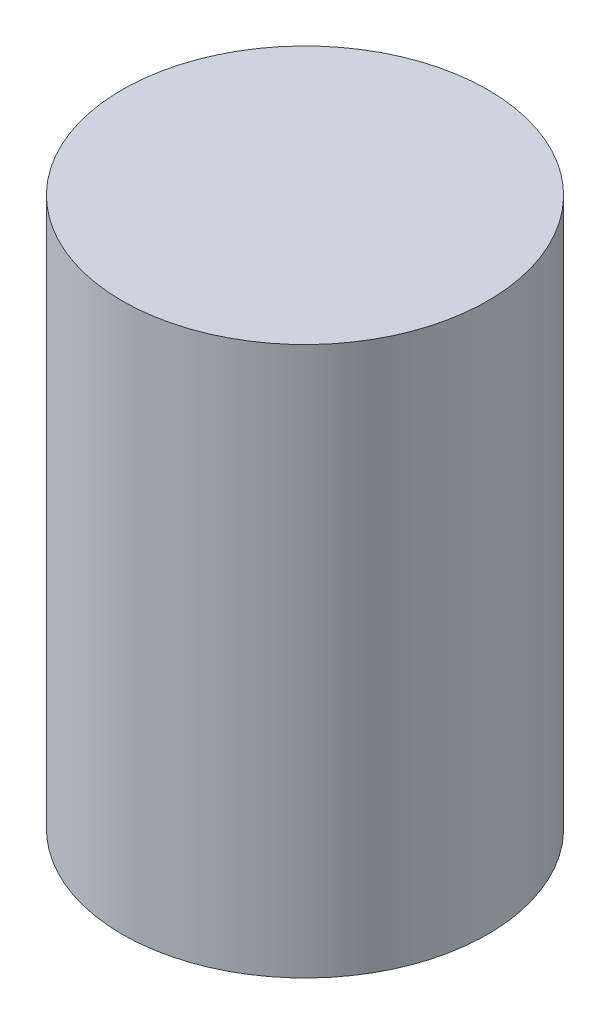
ISO-10303-21;
HEADER;
FILE_DESCRIPTION(('STEP AP214'),'2;1');
FILE_NAME('part.step','',(''),(''),'','','');
FILE_SCHEMA(('AUTOMOTIVE_DESIGN { 1 0 10303 214 1 1 1 1 }'));
ENDSEC;
DATA;
#1=APPLICATION_CONTEXT('core data for automotive mechanical design processes');
#2=APPLICATION_PROTOCOL_DEFINITION('international standard','automotive_design',2000,#1);
#3=PRODUCT_CONTEXT('',#1,'mechanical');
#4=PRODUCT('Part','Part','',(#3));
#5=PRODUCT_RELATED_PRODUCT_CATEGORY('part','',(#4));
#6=PRODUCT_DEFINITION_FORMATION('','',#4);
#7=PRODUCT_DEFINITION_CONTEXT('part definition',#1,'design');
#8=PRODUCT_DEFINITION('design','',#6,#7);
#9=PRODUCT_DEFINITION_SHAPE('','',#8);
#10=(LENGTH_UNIT() NAMED_UNIT(*) SI_UNIT(.MILLI.,.METRE.));
#11=(NAMED_UNIT(*) PLANE_ANGLE_UNIT() SI_UNIT($,.RADIAN.));
#12=(NAMED_UNIT(*) SI_UNIT($,.STERADIAN.) SOLID_ANGLE_UNIT());
#13=UNCERTAINTY_MEASURE_WITH_UNIT(LENGTH_MEASURE(1.E-05),#10,'distance_accuracy_value','');
#14=(GEOMETRIC_REPRESENTATION_CONTEXT(3) GLOBAL_UNCERTAINTY_ASSIGNED_CONTEXT((#13)) GLOBAL_UNIT_ASSIGNED_CONTEXT((#10,
#11,#12)) REPRESENTATION_CONTEXT('',''));
#15=CARTESIAN_POINT('',(0.,0.,0.));
#16=DIRECTION('',(0.,0.,1.));
#17=DIRECTION('',(1.,0.,0.));
#18=AXIS2_PLACEMENT_3D('',#15,#16,#17);
#19=CARTESIAN_POINT('',(0.,3.81,0.));
#20=DIRECTION('',(0.,-1.,0.));
#21=DIRECTION('',(0.,0.,-1.));
#22=AXIS2_PLACEMENT_3D('',#19,#20,#21);
#23=CYLINDRICAL_SURFACE('',#22,1.27);
#24=CARTESIAN_POINT('',(0.,3.81,0.));
#25=DIRECTION('',(0.,1.,0.));
#26=DIRECTION('',(0.,0.,1.));
#27=AXIS2_PLACEMENT_3D('',#24,#25,#26);
#28=CIRCLE('',#27,1.27);
#29=CARTESIAN_POINT('',(0.,3.81,-1.27));
#30=VERTEX_POINT('',#29);
#31=EDGE_CURVE('E10',#30,#30,#28,.T.);
#32=CARTESIAN_POINT('',(0.,0.,0.));
#33=DIRECTION('',(0.,1.,0.));
#34=DIRECTION('',(0.,0.,1.));
#35=AXIS2_PLACEMENT_3D('',#32,#33,#34);
#36=CIRCLE('',#35,1.27);
#37=CARTESIAN_POINT('',(0.,0.,-1.27));
#38=VERTEX_POINT('',#37);
#39=EDGE_CURVE('E34',#38,#38,#36,.T.);
#40=CARTESIAN_POINT('',(0.,3.81,-1.27));
#41=CARTESIAN_POINT('',(0.,3.7703125,-1.27));
#42=CARTESIAN_POINT('',(0.,3.730625,-1.27));
#43=CARTESIAN_POINT('',(0.,3.65125,-1.27));
#44=CARTESIAN_POINT('',(0.,3.6115625,-1.27));
#45=CARTESIAN_POINT('',(0.,3.5321875,-1.27));
#46=CARTESIAN_POINT('',(0.,3.4925,-1.27));
#47=CARTESIAN_POINT('',(0.,3.413125,-1.27));
#48=CARTESIAN_POINT('',(0.,3.3734375,-1.27));
#49=CARTESIAN_POINT('',(0.,3.2940625,-1.27));
#50=CARTESIAN_POINT('',(0.,3.254375,-1.27));
#51=CARTESIAN_POINT('',(0.,3.175,-1.27));
#52=CARTESIAN_POINT('',(0.,3.1353125,-1.27));
#53=CARTESIAN_POINT('',(0.,3.0559375,-1.27));
#54=CARTESIAN_POINT('',(0.,3.01625,-1.27));
#55=CARTESIAN_POINT('',(0.,2.936875,-1.27));
#56=CARTESIAN_POINT('',(0.,2.8971875,-1.27));
#57=CARTESIAN_POINT('',(0.,2.8178125,-1.27));
#58=CARTESIAN_POINT('',(0.,2.778125,-1.27));
#59=CARTESIAN_POINT('',(0.,2.69875,-1.27));
#60=CARTESIAN_POINT('',(0.,2.6590625,-1.27));
#61=CARTESIAN_POINT('',(0.,2.5796875,-1.27));
#62=CARTESIAN_POINT('',(0.,2.54,-1.27));
#63=CARTESIAN_POINT('',(0.,2.460625,-1.27));
#64=CARTESIAN_POINT('',(0.,2.4209375,-1.27));
#65=CARTESIAN_POINT('',(0.,2.3415625,-1.27));
#66=CARTESIAN_POINT('',(0.,2.301875,-1.27));
#67=CARTESIAN_POINT('',(0.,2.2225,-1.27));
#68=CARTESIAN_POINT('',(0.,2.1828125,-1.27));
#69=CARTESIAN_POINT('',(0.,2.1034375,-1.27));
#70=CARTESIAN_POINT('',(0.,2.06375,-1.27));
#71=CARTESIAN_POINT('',(0.,1.984375,-1.27));
#72=CARTESIAN_POINT('',(0.,1.9446875,-1.27));
#73=CARTESIAN_POINT('',(0.,1.8653125,-1.27));
#74=CARTESIAN_POINT('',(0.,1.825625,-1.27));
#75=CARTESIAN_POINT('',(0.,1.74625,-1.27));
#76=CARTESIAN_POINT('',(0.,1.7065625,-1.27));
#77=CARTESIAN_POINT('',(0.,1.6271875,-1.27));
#78=CARTESIAN_POINT('',(0.,1.5875,-1.27));
#79=CARTESIAN_POINT('',(0.,1.508125,-1.27));
#80=CARTESIAN_POINT('',(0.,1.4684375,-1.27));
#81=CARTESIAN_POINT('',(0.,1.3890625,-1.27));
#82=CARTESIAN_POINT('',(0.,1.349375,-1.27));
#83=CARTESIAN_POINT('',(0.,1.27,-1.27));
#84=CARTESIAN_POINT('',(0.,1.2303125,-1.27));
#85=CARTESIAN_POINT('',(0.,1.1509375,-1.27));
#86=CARTESIAN_POINT('',(0.,1.11125,-1.27));
#87=CARTESIAN_POINT('',(0.,1.031875,-1.27));
#88=CARTESIAN_POINT('',(0.,0.9921875,-1.27));
#89=CARTESIAN_POINT('',(0.,0.9128125,-1.27));
#90=CARTESIAN_POINT('',(0.,0.873125,-1.27));
#91=CARTESIAN_POINT('',(0.,0.79375,-1.27));
#92=CARTESIAN_POINT('',(0.,0.7540625,-1.27));
#93=CARTESIAN_POINT('',(0.,0.6746875,-1.27));
#94=CARTESIAN_POINT('',(0.,0.635,-1.27));
#95=CARTESIAN_POINT('',(0.,0.555625,-1.27));
#96=CARTESIAN_POINT('',(0.,0.5159375,-1.27));
#97=CARTESIAN_POINT('',(0.,0.4365625,-1.27));
#98=CARTESIAN_POINT('',(0.,0.396875,-1.27));
#99=CARTESIAN_POINT('',(0.,0.3175,-1.27));
#100=CARTESIAN_POINT('',(0.,0.2778125,-1.27));
#101=CARTESIAN_POINT('',(0.,0.1984375,-1.27));
#102=CARTESIAN_POINT('',(0.,0.15875,-1.27));
#103=CARTESIAN_POINT('',(0.,0.0793749999999999,-1.27));
#104=CARTESIAN_POINT('',(0.,0.0396874999999999,-1.27));
#105=CARTESIAN_POINT('',(0.,0.,-1.27));
#106=B_SPLINE_CURVE_WITH_KNOTS('',3,(#40,#41,#42,#43,#44,#45,#46,#47,#48,#49,#50,#51,#52,#53,
#54,#55,#56,#57,#58,#59,#60,#61,#62,#63,#64,#65,#66,#67,#68,#69,#70,#71,#72,#73,#74,#75,#76,#77,
#78,#79,#80,#81,#82,#83,#84,#85,#86,#87,#88,#89,#90,#91,#92,#93,#94,#95,#96,#97,#98,#99,#100,
#101,#102,#103,#104,#105),.UNSPECIFIED.,.F.,.F.,(4,2,2,2,2,2,2,2,2,2,2,2,2,2,2,2,2,2,2,2,2,2,2,
2,2,2,2,2,2,2,2,2,4),(0.,0.1190625,0.238125,0.3571875,0.47625,0.5953125,0.714375,0.8334375,
0.9525,1.0715625,1.190625,1.3096875,1.42875,1.5478125,1.666875,1.7859375,1.905,2.0240625,
2.143125,2.2621875,2.38125,2.5003125,2.619375,2.7384375,2.8575,2.9765625,3.095625,3.2146875,
3.33375,3.4528125,3.571875,3.6909375,3.81),.UNSPECIFIED.);
#107=EDGE_CURVE('BSEAM31',#30,#38,#106,.T.);
#108=ORIENTED_EDGE('',*,*,#31,.F.);
#109=ORIENTED_EDGE('',*,*,#39,.T.);
#110=ORIENTED_EDGE('',*,*,#107,.T.);
#111=ORIENTED_EDGE('',*,*,#107,.F.);
#112=EDGE_LOOP('',(#108,#110,#109,#111));
#113=FACE_BOUND('',#112,.T.);
#114=ADVANCED_FACE('F31',(#113),#23,.T.);
#115=CARTESIAN_POINT('',(0.,3.81,0.));
#116=DIRECTION('',(0.,1.,0.));
#117=DIRECTION('',(0.,0.,1.));
#118=AXIS2_PLACEMENT_3D('',#115,#116,#117);
#119=PLANE('',#118);
#120=ORIENTED_EDGE('',*,*,#31,.T.);
#121=EDGE_LOOP('',(#120));
#122=FACE_BOUND('',#121,.T.);
#123=ADVANCED_FACE('F46',(#122),#119,.T.);
#124=CARTESIAN_POINT('',(0.,0.,0.));
#125=DIRECTION('',(0.,1.,0.));
#126=DIRECTION('',(0.,0.,1.));
#127=AXIS2_PLACEMENT_3D('',#124,#125,#126);
#128=PLANE('',#127);
#129=ORIENTED_EDGE('',*,*,#39,.F.);
#130=EDGE_LOOP('',(#129));
#131=FACE_BOUND('',#130,.T.);
#132=ADVANCED_FACE('F44',(#131),#128,.F.);
#133=CLOSED_SHELL('',(#114,#123,#132));
#134=MANIFOLD_SOLID_BREP('B2',#133);
#135=ADVANCED_BREP_SHAPE_REPRESENTATION('',(#18,#134),#14);
#136=SHAPE_DEFINITION_REPRESENTATION(#9,#135);
ENDSEC;
END-ISO-10303-21;
